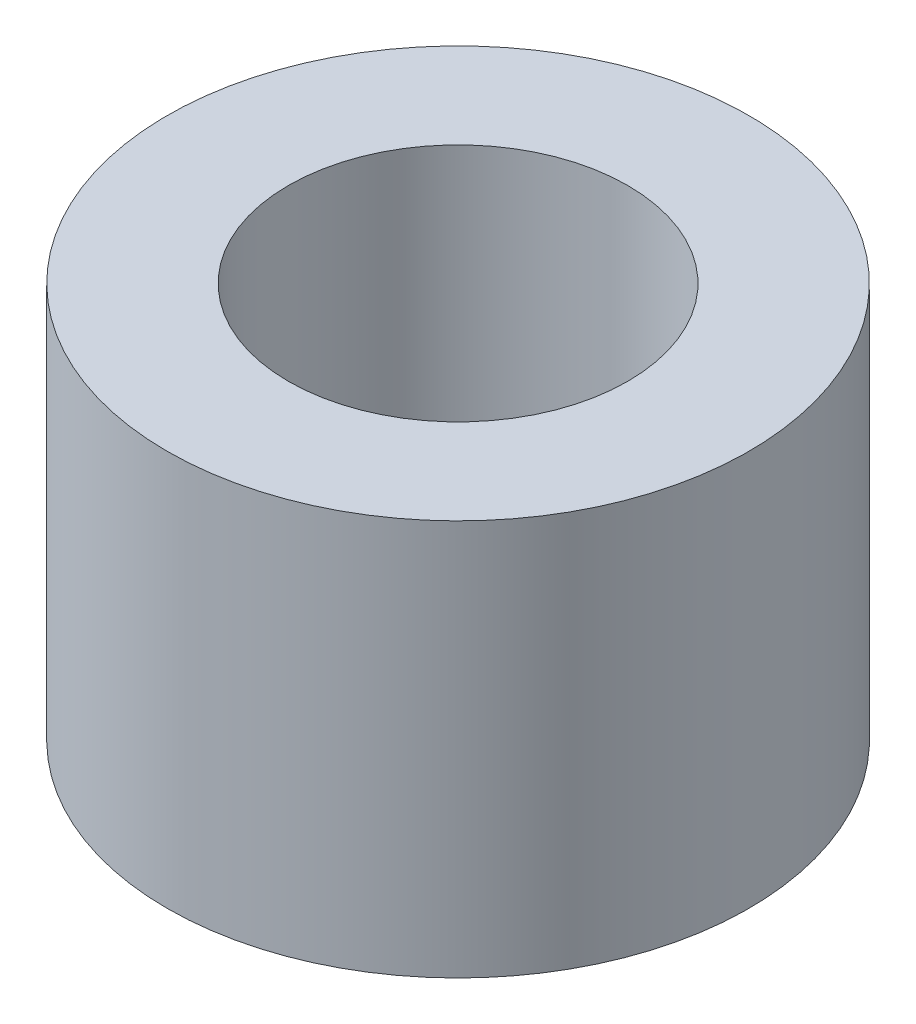
ISO-10303-21;
HEADER;
FILE_DESCRIPTION(('STEP AP214'),'2;1');
FILE_NAME('part.step','',(''),(''),'','','');
FILE_SCHEMA(('AUTOMOTIVE_DESIGN { 1 0 10303 214 1 1 1 1 }'));
ENDSEC;
DATA;
#1=APPLICATION_CONTEXT('core data for automotive mechanical design processes');
#2=APPLICATION_PROTOCOL_DEFINITION('international standard','automotive_design',2000,#1);
#3=PRODUCT_CONTEXT('',#1,'mechanical');
#4=PRODUCT('Part','Part','',(#3));
#5=PRODUCT_RELATED_PRODUCT_CATEGORY('part','',(#4));
#6=PRODUCT_DEFINITION_FORMATION('','',#4);
#7=PRODUCT_DEFINITION_CONTEXT('part definition',#1,'design');
#8=PRODUCT_DEFINITION('design','',#6,#7);
#9=PRODUCT_DEFINITION_SHAPE('','',#8);
#10=(LENGTH_UNIT() NAMED_UNIT(*) SI_UNIT(.MILLI.,.METRE.));
#11=(NAMED_UNIT(*) PLANE_ANGLE_UNIT() SI_UNIT($,.RADIAN.));
#12=(NAMED_UNIT(*) SI_UNIT($,.STERADIAN.) SOLID_ANGLE_UNIT());
#13=UNCERTAINTY_MEASURE_WITH_UNIT(LENGTH_MEASURE(1.E-05),#10,'distance_accuracy_value','');
#14=(GEOMETRIC_REPRESENTATION_CONTEXT(3) GLOBAL_UNCERTAINTY_ASSIGNED_CONTEXT((#13)) GLOBAL_UNIT_ASSIGNED_CONTEXT((#10,
#11,#12)) REPRESENTATION_CONTEXT('',''));
#15=CARTESIAN_POINT('',(0.,0.,0.));
#16=DIRECTION('',(0.,0.,1.));
#17=DIRECTION('',(1.,0.,0.));
#18=AXIS2_PLACEMENT_3D('',#15,#16,#17);
#19=CARTESIAN_POINT('',(0.,4.9,0.));
#20=DIRECTION('',(0.,1.,0.));
#21=DIRECTION('',(0.,0.,1.));
#22=AXIS2_PLACEMENT_3D('',#19,#20,#21);
#23=PLANE('',#22);
#24=CARTESIAN_POINT('',(0.,4.9,0.));
#25=DIRECTION('',(0.,1.,0.));
#26=DIRECTION('',(0.,0.,1.));
#27=AXIS2_PLACEMENT_3D('',#24,#25,#26);
#28=CIRCLE('',#27,3.6);
#29=CARTESIAN_POINT('',(0.,4.9,3.6));
#30=VERTEX_POINT('',#29);
#31=EDGE_CURVE('E10',#30,#30,#28,.T.);
#32=ORIENTED_EDGE('',*,*,#31,.T.);
#33=EDGE_LOOP('',(#32));
#34=FACE_BOUND('',#33,.T.);
#35=CARTESIAN_POINT('',(0.,4.9,0.));
#36=DIRECTION('',(0.,1.,0.));
#37=DIRECTION('',(0.,0.,1.));
#38=AXIS2_PLACEMENT_3D('',#35,#36,#37);
#39=CIRCLE('',#38,2.1);
#40=CARTESIAN_POINT('',(0.,4.9,2.1));
#41=VERTEX_POINT('',#40);
#42=EDGE_CURVE('E58',#41,#41,#39,.T.);
#43=ORIENTED_EDGE('',*,*,#42,.F.);
#44=EDGE_LOOP('',(#43));
#45=FACE_BOUND('',#44,.T.);
#46=ADVANCED_FACE('F45',(#34,#45),#23,.T.);
#47=CARTESIAN_POINT('',(0.,0.,0.));
#48=DIRECTION('',(0.,1.,0.));
#49=DIRECTION('',(0.,0.,1.));
#50=AXIS2_PLACEMENT_3D('',#47,#48,#49);
#51=PLANE('',#50);
#52=CARTESIAN_POINT('',(0.,0.,0.));
#53=DIRECTION('',(0.,1.,0.));
#54=DIRECTION('',(0.,0.,1.));
#55=AXIS2_PLACEMENT_3D('',#52,#53,#54);
#56=CIRCLE('',#55,3.6);
#57=CARTESIAN_POINT('',(0.,0.,3.6));
#58=VERTEX_POINT('',#57);
#59=EDGE_CURVE('E49',#58,#58,#56,.T.);
#60=ORIENTED_EDGE('',*,*,#59,.F.);
#61=EDGE_LOOP('',(#60));
#62=FACE_BOUND('',#61,.T.);
#63=CARTESIAN_POINT('',(0.,0.,0.));
#64=DIRECTION('',(0.,1.,0.));
#65=DIRECTION('',(0.,0.,1.));
#66=AXIS2_PLACEMENT_3D('',#63,#64,#65);
#67=CIRCLE('',#66,2.1);
#68=CARTESIAN_POINT('',(0.,0.,2.1));
#69=VERTEX_POINT('',#68);
#70=EDGE_CURVE('E60',#69,#69,#67,.T.);
#71=ORIENTED_EDGE('',*,*,#70,.T.);
#72=EDGE_LOOP('',(#71));
#73=FACE_BOUND('',#72,.T.);
#74=ADVANCED_FACE('F72',(#62,#73),#51,.F.);
#75=CARTESIAN_POINT('',(0.,4.9,0.));
#76=DIRECTION('',(0.,-1.,0.));
#77=DIRECTION('',(0.,0.,-1.));
#78=AXIS2_PLACEMENT_3D('',#75,#76,#77);
#79=CYLINDRICAL_SURFACE('',#78,3.6);
#80=ORIENTED_EDGE('',*,*,#31,.F.);
#81=EDGE_LOOP('',(#80));
#82=FACE_BOUND('',#81,.T.);
#83=ORIENTED_EDGE('',*,*,#59,.T.);
#84=EDGE_LOOP('',(#83));
#85=FACE_BOUND('',#84,.T.);
#86=ADVANCED_FACE('F47',(#82,#85),#79,.T.);
#87=CARTESIAN_POINT('',(0.,4.9,0.));
#88=DIRECTION('',(0.,-1.,0.));
#89=DIRECTION('',(0.,0.,-1.));
#90=AXIS2_PLACEMENT_3D('',#87,#88,#89);
#91=CYLINDRICAL_SURFACE('',#90,2.1);
#92=ORIENTED_EDGE('',*,*,#42,.T.);
#93=EDGE_LOOP('',(#92));
#94=FACE_BOUND('',#93,.T.);
#95=ORIENTED_EDGE('',*,*,#70,.F.);
#96=EDGE_LOOP('',(#95));
#97=FACE_BOUND('',#96,.T.);
#98=ADVANCED_FACE('F68',(#94,#97),#91,.F.);
#99=CLOSED_SHELL('',(#46,#74,#86,#98));
#100=MANIFOLD_SOLID_BREP('B2',#99);
#101=ADVANCED_BREP_SHAPE_REPRESENTATION('',(#18,#100),#14);
#102=SHAPE_DEFINITION_REPRESENTATION(#9,#101);
ENDSEC;
END-ISO-10303-21;
